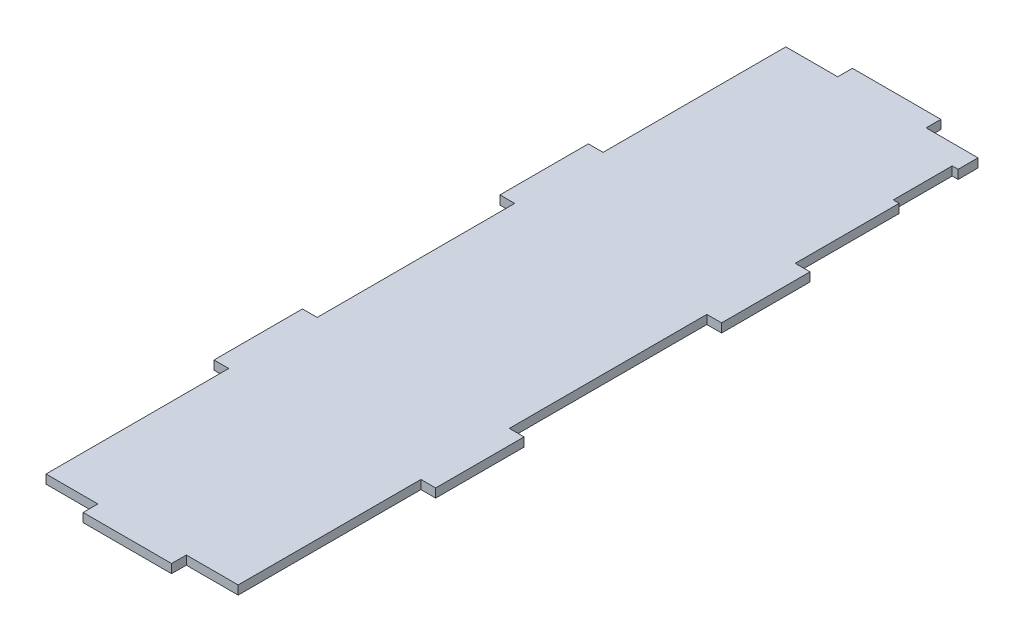
ISO-10303-21;
HEADER;
FILE_DESCRIPTION(('STEP AP214'),'2;1');
FILE_NAME('part.step','',(''),(''),'','','');
FILE_SCHEMA(('AUTOMOTIVE_DESIGN { 1 0 10303 214 1 1 1 1 }'));
ENDSEC;
DATA;
#1=APPLICATION_CONTEXT('core data for automotive mechanical design processes');
#2=APPLICATION_PROTOCOL_DEFINITION('international standard','automotive_design',2000,#1);
#3=PRODUCT_CONTEXT('',#1,'mechanical');
#4=PRODUCT('Part','Part','',(#3));
#5=PRODUCT_RELATED_PRODUCT_CATEGORY('part','',(#4));
#6=PRODUCT_DEFINITION_FORMATION('','',#4);
#7=PRODUCT_DEFINITION_CONTEXT('part definition',#1,'design');
#8=PRODUCT_DEFINITION('design','',#6,#7);
#9=PRODUCT_DEFINITION_SHAPE('','',#8);
#10=(LENGTH_UNIT() NAMED_UNIT(*) SI_UNIT(.MILLI.,.METRE.));
#11=(NAMED_UNIT(*) PLANE_ANGLE_UNIT() SI_UNIT($,.RADIAN.));
#12=(NAMED_UNIT(*) SI_UNIT($,.STERADIAN.) SOLID_ANGLE_UNIT());
#13=UNCERTAINTY_MEASURE_WITH_UNIT(LENGTH_MEASURE(1.E-05),#10,'distance_accuracy_value','');
#14=(GEOMETRIC_REPRESENTATION_CONTEXT(3) GLOBAL_UNCERTAINTY_ASSIGNED_CONTEXT((#13)) GLOBAL_UNIT_ASSIGNED_CONTEXT((#10,
#11,#12)) REPRESENTATION_CONTEXT('',''));
#15=CARTESIAN_POINT('',(0.,0.,0.));
#16=DIRECTION('',(0.,0.,1.));
#17=DIRECTION('',(1.,0.,0.));
#18=AXIS2_PLACEMENT_3D('',#15,#16,#17);
#19=CARTESIAN_POINT('',(32.6,0.,-63.5));
#20=DIRECTION('',(1.,0.,0.));
#21=DIRECTION('',(0.,0.,-1.));
#22=AXIS2_PLACEMENT_3D('',#19,#20,#21);
#23=PLANE('',#22);
#24=DIRECTION('',(0.,1.,0.));
#25=VECTOR('',#24,1.);
#26=CARTESIAN_POINT('',(32.6,0.,-118.75));
#27=LINE('',#26,#25);
#28=CARTESIAN_POINT('',(32.6,0.,-118.75));
#29=VERTEX_POINT('',#28);
#30=CARTESIAN_POINT('',(32.6,3.,-118.75));
#31=VERTEX_POINT('',#30);
#32=EDGE_CURVE('E293',#29,#31,#27,.T.);
#33=ORIENTED_EDGE('',*,*,#32,.F.);
#34=DIRECTION('',(0.,0.,-1.));
#35=VECTOR('',#34,1.);
#36=CARTESIAN_POINT('',(32.6,0.,-63.5));
#37=LINE('',#36,#35);
#38=CARTESIAN_POINT('',(32.6,0.,-125.5));
#39=VERTEX_POINT('',#38);
#40=EDGE_CURVE('E386',#29,#39,#37,.T.);
#41=ORIENTED_EDGE('',*,*,#40,.T.);
#42=DIRECTION('',(0.,1.,0.));
#43=VECTOR('',#42,1.);
#44=CARTESIAN_POINT('',(32.6,0.,-125.5));
#45=LINE('',#44,#43);
#46=CARTESIAN_POINT('',(32.6,3.,-125.5));
#47=VERTEX_POINT('',#46);
#48=EDGE_CURVE('E415',#39,#47,#45,.T.);
#49=ORIENTED_EDGE('',*,*,#48,.T.);
#50=DIRECTION('',(0.,0.,-1.));
#51=VECTOR('',#50,1.);
#52=CARTESIAN_POINT('',(32.6,3.,-63.5));
#53=LINE('',#52,#51);
#54=EDGE_CURVE('E401',#31,#47,#53,.T.);
#55=ORIENTED_EDGE('',*,*,#54,.F.);
#56=EDGE_LOOP('',(#33,#41,#49,#55));
#57=FACE_BOUND('',#56,.T.);
#58=ADVANCED_FACE('F43',(#57),#23,.T.);
#59=CARTESIAN_POINT('',(37.6,3.,130.5));
#60=DIRECTION('',(0.,0.,-1.));
#61=DIRECTION('',(-1.,0.,0.));
#62=AXIS2_PLACEMENT_3D('',#59,#60,#61);
#63=PLANE('',#62);
#64=DIRECTION('',(0.,1.,0.));
#65=VECTOR('',#64,1.);
#66=CARTESIAN_POINT('',(15.,0.,130.5));
#67=LINE('',#66,#65);
#68=CARTESIAN_POINT('',(15.,0.,130.5));
#69=VERTEX_POINT('',#68);
#70=CARTESIAN_POINT('',(15.,3.,130.5));
#71=VERTEX_POINT('',#70);
#72=EDGE_CURVE('E328',#69,#71,#67,.T.);
#73=ORIENTED_EDGE('',*,*,#72,.T.);
#74=DIRECTION('',(1.,0.,0.));
#75=VECTOR('',#74,1.);
#76=CARTESIAN_POINT('',(37.6,3.,130.5));
#77=LINE('',#76,#75);
#78=CARTESIAN_POINT('',(-15.,3.,130.5));
#79=VERTEX_POINT('',#78);
#80=EDGE_CURVE('E560',#79,#71,#77,.T.);
#81=ORIENTED_EDGE('',*,*,#80,.F.);
#82=DIRECTION('',(0.,1.,0.));
#83=VECTOR('',#82,1.);
#84=CARTESIAN_POINT('',(-15.,0.,130.5));
#85=LINE('',#84,#83);
#86=CARTESIAN_POINT('',(-15.,0.,130.5));
#87=VERTEX_POINT('',#86);
#88=EDGE_CURVE('E441',#87,#79,#85,.T.);
#89=ORIENTED_EDGE('',*,*,#88,.F.);
#90=DIRECTION('',(1.,0.,0.));
#91=VECTOR('',#90,1.);
#92=CARTESIAN_POINT('',(37.6,0.,130.5));
#93=LINE('',#92,#91);
#94=EDGE_CURVE('E572',#87,#69,#93,.T.);
#95=ORIENTED_EDGE('',*,*,#94,.T.);
#96=EDGE_LOOP('',(#73,#81,#89,#95));
#97=FACE_BOUND('',#96,.T.);
#98=ADVANCED_FACE('F632',(#97),#63,.F.);
#99=CARTESIAN_POINT('',(37.6,3.,130.5));
#100=DIRECTION('',(-1.,0.,0.));
#101=DIRECTION('',(0.,0.,1.));
#102=AXIS2_PLACEMENT_3D('',#99,#100,#101);
#103=PLANE('',#102);
#104=DIRECTION('',(0.,1.,0.));
#105=VECTOR('',#104,1.);
#106=CARTESIAN_POINT('',(37.6,0.,63.5));
#107=LINE('',#106,#105);
#108=CARTESIAN_POINT('',(37.6,0.,63.5));
#109=VERTEX_POINT('',#108);
#110=CARTESIAN_POINT('',(37.6,3.,63.5));
#111=VERTEX_POINT('',#110);
#112=EDGE_CURVE('E311',#109,#111,#107,.T.);
#113=ORIENTED_EDGE('',*,*,#112,.F.);
#114=DIRECTION('',(0.,0.,-1.));
#115=VECTOR('',#114,1.);
#116=CARTESIAN_POINT('',(37.6,0.,130.5));
#117=LINE('',#116,#115);
#118=CARTESIAN_POINT('',(37.6,0.,33.5));
#119=VERTEX_POINT('',#118);
#120=EDGE_CURVE('E578',#109,#119,#117,.T.);
#121=ORIENTED_EDGE('',*,*,#120,.T.);
#122=DIRECTION('',(0.,1.,0.));
#123=VECTOR('',#122,1.);
#124=CARTESIAN_POINT('',(37.6,0.,33.5));
#125=LINE('',#124,#123);
#126=CARTESIAN_POINT('',(37.6,3.,33.5));
#127=VERTEX_POINT('',#126);
#128=EDGE_CURVE('E317',#119,#127,#125,.T.);
#129=ORIENTED_EDGE('',*,*,#128,.T.);
#130=DIRECTION('',(0.,0.,-1.));
#131=VECTOR('',#130,1.);
#132=CARTESIAN_POINT('',(37.6,3.,130.5));
#133=LINE('',#132,#131);
#134=EDGE_CURVE('E53',#111,#127,#133,.T.);
#135=ORIENTED_EDGE('',*,*,#134,.F.);
#136=EDGE_LOOP('',(#113,#121,#129,#135));
#137=FACE_BOUND('',#136,.T.);
#138=ADVANCED_FACE('F640',(#137),#103,.F.);
#139=DIRECTION('',(0.,1.,0.));
#140=VECTOR('',#139,1.);
#141=CARTESIAN_POINT('',(37.6,0.,-33.5));
#142=LINE('',#141,#140);
#143=CARTESIAN_POINT('',(37.6,0.,-33.5));
#144=VERTEX_POINT('',#143);
#145=CARTESIAN_POINT('',(37.6,3.,-33.5));
#146=VERTEX_POINT('',#145);
#147=EDGE_CURVE('E354',#144,#146,#142,.T.);
#148=ORIENTED_EDGE('',*,*,#147,.F.);
#149=CARTESIAN_POINT('',(37.6,0.,-63.5));
#150=VERTEX_POINT('',#149);
#151=EDGE_CURVE('E575',#144,#150,#117,.T.);
#152=ORIENTED_EDGE('',*,*,#151,.T.);
#153=DIRECTION('',(0.,1.,0.));
#154=VECTOR('',#153,1.);
#155=CARTESIAN_POINT('',(37.6,0.,-63.5));
#156=LINE('',#155,#154);
#157=CARTESIAN_POINT('',(37.6,3.,-63.5));
#158=VERTEX_POINT('',#157);
#159=EDGE_CURVE('E360',#150,#158,#156,.T.);
#160=ORIENTED_EDGE('',*,*,#159,.T.);
#161=EDGE_CURVE('E564',#146,#158,#133,.T.);
#162=ORIENTED_EDGE('',*,*,#161,.F.);
#163=EDGE_LOOP('',(#148,#152,#160,#162));
#164=FACE_BOUND('',#163,.T.);
#165=ADVANCED_FACE('F657',(#164),#103,.F.);
#166=CARTESIAN_POINT('',(37.6,3.,-130.5));
#167=DIRECTION('',(0.,0.,1.));
#168=DIRECTION('',(1.,0.,0.));
#169=AXIS2_PLACEMENT_3D('',#166,#167,#168);
#170=PLANE('',#169);
#171=DIRECTION('',(0.,1.,0.));
#172=VECTOR('',#171,1.);
#173=CARTESIAN_POINT('',(15.,0.,-130.5));
#174=LINE('',#173,#172);
#175=CARTESIAN_POINT('',(15.,0.,-130.5));
#176=VERTEX_POINT('',#175);
#177=CARTESIAN_POINT('',(15.,3.,-130.5));
#178=VERTEX_POINT('',#177);
#179=EDGE_CURVE('E393',#176,#178,#174,.T.);
#180=ORIENTED_EDGE('',*,*,#179,.F.);
#181=DIRECTION('',(-1.,0.,0.));
#182=VECTOR('',#181,1.);
#183=CARTESIAN_POINT('',(37.6,0.,-130.5));
#184=LINE('',#183,#182);
#185=CARTESIAN_POINT('',(-15.,0.,-130.5));
#186=VERTEX_POINT('',#185);
#187=EDGE_CURVE('E47',#176,#186,#184,.T.);
#188=ORIENTED_EDGE('',*,*,#187,.T.);
#189=DIRECTION('',(0.,1.,0.));
#190=VECTOR('',#189,1.);
#191=CARTESIAN_POINT('',(-15.,0.,-130.5));
#192=LINE('',#191,#190);
#193=CARTESIAN_POINT('',(-15.,3.,-130.5));
#194=VERTEX_POINT('',#193);
#195=EDGE_CURVE('E332',#186,#194,#192,.T.);
#196=ORIENTED_EDGE('',*,*,#195,.T.);
#197=DIRECTION('',(-1.,0.,0.));
#198=VECTOR('',#197,1.);
#199=CARTESIAN_POINT('',(37.6,3.,-130.5));
#200=LINE('',#199,#198);
#201=EDGE_CURVE('E11',#178,#194,#200,.T.);
#202=ORIENTED_EDGE('',*,*,#201,.F.);
#203=EDGE_LOOP('',(#180,#188,#196,#202));
#204=FACE_BOUND('',#203,.T.);
#205=ADVANCED_FACE('F592',(#204),#170,.F.);
#206=CARTESIAN_POINT('',(0.,3.,0.));
#207=DIRECTION('',(0.,1.,0.));
#208=DIRECTION('',(0.,0.,1.));
#209=AXIS2_PLACEMENT_3D('',#206,#207,#208);
#210=PLANE('',#209);
#211=DIRECTION('',(-1.,0.,0.));
#212=VECTOR('',#211,1.);
#213=CARTESIAN_POINT('',(32.6,3.,-118.75));
#214=LINE('',#213,#212);
#215=CARTESIAN_POINT('',(30.6,3.,-118.75));
#216=VERTEX_POINT('',#215);
#217=EDGE_CURVE('E277',#31,#216,#214,.T.);
#218=ORIENTED_EDGE('',*,*,#217,.F.);
#219=ORIENTED_EDGE('',*,*,#54,.T.);
#220=DIRECTION('',(-1.,0.,0.));
#221=VECTOR('',#220,1.);
#222=CARTESIAN_POINT('',(32.6,3.,-125.5));
#223=LINE('',#222,#221);
#224=CARTESIAN_POINT('',(15.,3.,-125.5));
#225=VERTEX_POINT('',#224);
#226=EDGE_CURVE('E397',#47,#225,#223,.T.);
#227=ORIENTED_EDGE('',*,*,#226,.T.);
#228=DIRECTION('',(0.,0.,-1.));
#229=VECTOR('',#228,1.);
#230=CARTESIAN_POINT('',(15.,3.,-125.5));
#231=LINE('',#230,#229);
#232=EDGE_CURVE('E292',#225,#178,#231,.T.);
#233=ORIENTED_EDGE('',*,*,#232,.T.);
#234=ORIENTED_EDGE('',*,*,#201,.T.);
#235=DIRECTION('',(0.,0.,-1.));
#236=VECTOR('',#235,1.);
#237=CARTESIAN_POINT('',(-15.,3.,-125.5));
#238=LINE('',#237,#236);
#239=CARTESIAN_POINT('',(-15.,3.,-125.5));
#240=VERTEX_POINT('',#239);
#241=EDGE_CURVE('E525',#240,#194,#238,.T.);
#242=ORIENTED_EDGE('',*,*,#241,.F.);
#243=DIRECTION('',(1.,0.,0.));
#244=VECTOR('',#243,1.);
#245=CARTESIAN_POINT('',(-32.6,3.,-125.5));
#246=LINE('',#245,#244);
#247=CARTESIAN_POINT('',(-32.6,3.,-125.5));
#248=VERTEX_POINT('',#247);
#249=EDGE_CURVE('E529',#248,#240,#246,.T.);
#250=ORIENTED_EDGE('',*,*,#249,.F.);
#251=DIRECTION('',(0.,0.,-1.));
#252=VECTOR('',#251,1.);
#253=CARTESIAN_POINT('',(-32.6,3.,-63.5));
#254=LINE('',#253,#252);
#255=CARTESIAN_POINT('',(-32.6,3.,-63.5));
#256=VERTEX_POINT('',#255);
#257=EDGE_CURVE('E534',#256,#248,#254,.T.);
#258=ORIENTED_EDGE('',*,*,#257,.F.);
#259=DIRECTION('',(1.,0.,0.));
#260=VECTOR('',#259,1.);
#261=CARTESIAN_POINT('',(-37.6,3.,-63.5));
#262=LINE('',#261,#260);
#263=CARTESIAN_POINT('',(-37.6,3.,-63.5));
#264=VERTEX_POINT('',#263);
#265=EDGE_CURVE('E487',#264,#256,#262,.T.);
#266=ORIENTED_EDGE('',*,*,#265,.F.);
#267=DIRECTION('',(0.,0.,1.));
#268=VECTOR('',#267,1.);
#269=CARTESIAN_POINT('',(-37.6,3.,130.5));
#270=LINE('',#269,#268);
#271=CARTESIAN_POINT('',(-37.6,3.,-33.5));
#272=VERTEX_POINT('',#271);
#273=EDGE_CURVE('E559',#264,#272,#270,.T.);
#274=ORIENTED_EDGE('',*,*,#273,.T.);
#275=DIRECTION('',(-1.,0.,0.));
#276=VECTOR('',#275,1.);
#277=CARTESIAN_POINT('',(-37.6,3.,-33.5));
#278=LINE('',#277,#276);
#279=CARTESIAN_POINT('',(-32.6,3.,-33.5));
#280=VERTEX_POINT('',#279);
#281=EDGE_CURVE('E488',#280,#272,#278,.T.);
#282=ORIENTED_EDGE('',*,*,#281,.F.);
#283=DIRECTION('',(0.,0.,-1.));
#284=VECTOR('',#283,1.);
#285=CARTESIAN_POINT('',(-32.6,3.,33.5));
#286=LINE('',#285,#284);
#287=CARTESIAN_POINT('',(-32.6,3.,33.5));
#288=VERTEX_POINT('',#287);
#289=EDGE_CURVE('E491',#288,#280,#286,.T.);
#290=ORIENTED_EDGE('',*,*,#289,.F.);
#291=DIRECTION('',(1.,0.,0.));
#292=VECTOR('',#291,1.);
#293=CARTESIAN_POINT('',(-37.6,3.,33.5));
#294=LINE('',#293,#292);
#295=CARTESIAN_POINT('',(-37.6,3.,33.5));
#296=VERTEX_POINT('',#295);
#297=EDGE_CURVE('E447',#296,#288,#294,.T.);
#298=ORIENTED_EDGE('',*,*,#297,.F.);
#299=CARTESIAN_POINT('',(-37.6,3.,63.5));
#300=VERTEX_POINT('',#299);
#301=EDGE_CURVE('E555',#296,#300,#270,.T.);
#302=ORIENTED_EDGE('',*,*,#301,.T.);
#303=DIRECTION('',(-1.,0.,0.));
#304=VECTOR('',#303,1.);
#305=CARTESIAN_POINT('',(-37.6,3.,63.5));
#306=LINE('',#305,#304);
#307=CARTESIAN_POINT('',(-32.6,3.,63.5));
#308=VERTEX_POINT('',#307);
#309=EDGE_CURVE('E429',#308,#300,#306,.T.);
#310=ORIENTED_EDGE('',*,*,#309,.F.);
#311=DIRECTION('',(0.,0.,-1.));
#312=VECTOR('',#311,1.);
#313=CARTESIAN_POINT('',(-32.6,3.,63.5));
#314=LINE('',#313,#312);
#315=CARTESIAN_POINT('',(-32.6,3.,125.5));
#316=VERTEX_POINT('',#315);
#317=EDGE_CURVE('E451',#316,#308,#314,.T.);
#318=ORIENTED_EDGE('',*,*,#317,.F.);
#319=DIRECTION('',(-1.,0.,0.));
#320=VECTOR('',#319,1.);
#321=CARTESIAN_POINT('',(-32.6,3.,125.5));
#322=LINE('',#321,#320);
#323=CARTESIAN_POINT('',(-15.,3.,125.5));
#324=VERTEX_POINT('',#323);
#325=EDGE_CURVE('E446',#324,#316,#322,.T.);
#326=ORIENTED_EDGE('',*,*,#325,.F.);
#327=DIRECTION('',(0.,0.,-1.));
#328=VECTOR('',#327,1.);
#329=CARTESIAN_POINT('',(-15.,3.,125.5));
#330=LINE('',#329,#328);
#331=EDGE_CURVE('E442',#79,#324,#330,.T.);
#332=ORIENTED_EDGE('',*,*,#331,.F.);
#333=ORIENTED_EDGE('',*,*,#80,.T.);
#334=DIRECTION('',(0.,0.,-1.));
#335=VECTOR('',#334,1.);
#336=CARTESIAN_POINT('',(15.,3.,125.5));
#337=LINE('',#336,#335);
#338=CARTESIAN_POINT('',(15.,3.,125.5));
#339=VERTEX_POINT('',#338);
#340=EDGE_CURVE('E302',#71,#339,#337,.T.);
#341=ORIENTED_EDGE('',*,*,#340,.T.);
#342=DIRECTION('',(1.,0.,0.));
#343=VECTOR('',#342,1.);
#344=CARTESIAN_POINT('',(32.6,3.,125.5));
#345=LINE('',#344,#343);
#346=CARTESIAN_POINT('',(32.6,3.,125.5));
#347=VERTEX_POINT('',#346);
#348=EDGE_CURVE('E321',#339,#347,#345,.T.);
#349=ORIENTED_EDGE('',*,*,#348,.T.);
#350=DIRECTION('',(0.,0.,-1.));
#351=VECTOR('',#350,1.);
#352=CARTESIAN_POINT('',(32.6,3.,63.5));
#353=LINE('',#352,#351);
#354=CARTESIAN_POINT('',(32.6,3.,63.5));
#355=VERTEX_POINT('',#354);
#356=EDGE_CURVE('E316',#347,#355,#353,.T.);
#357=ORIENTED_EDGE('',*,*,#356,.T.);
#358=DIRECTION('',(1.,0.,0.));
#359=VECTOR('',#358,1.);
#360=CARTESIAN_POINT('',(37.6,3.,63.5));
#361=LINE('',#360,#359);
#362=EDGE_CURVE('E312',#355,#111,#361,.T.);
#363=ORIENTED_EDGE('',*,*,#362,.T.);
#364=ORIENTED_EDGE('',*,*,#134,.T.);
#365=DIRECTION('',(-1.,0.,0.));
#366=VECTOR('',#365,1.);
#367=CARTESIAN_POINT('',(37.6,3.,33.5));
#368=LINE('',#367,#366);
#369=CARTESIAN_POINT('',(32.6,3.,33.5));
#370=VERTEX_POINT('',#369);
#371=EDGE_CURVE('E347',#127,#370,#368,.T.);
#372=ORIENTED_EDGE('',*,*,#371,.T.);
#373=DIRECTION('',(0.,0.,-1.));
#374=VECTOR('',#373,1.);
#375=CARTESIAN_POINT('',(32.6,3.,33.5));
#376=LINE('',#375,#374);
#377=CARTESIAN_POINT('',(32.6,3.,-33.5));
#378=VERTEX_POINT('',#377);
#379=EDGE_CURVE('E359',#370,#378,#376,.T.);
#380=ORIENTED_EDGE('',*,*,#379,.T.);
#381=DIRECTION('',(1.,0.,0.));
#382=VECTOR('',#381,1.);
#383=CARTESIAN_POINT('',(37.6,3.,-33.5));
#384=LINE('',#383,#382);
#385=EDGE_CURVE('E355',#378,#146,#384,.T.);
#386=ORIENTED_EDGE('',*,*,#385,.T.);
#387=ORIENTED_EDGE('',*,*,#161,.T.);
#388=DIRECTION('',(-1.,0.,0.));
#389=VECTOR('',#388,1.);
#390=CARTESIAN_POINT('',(37.6,3.,-63.5));
#391=LINE('',#390,#389);
#392=CARTESIAN_POINT('',(32.6,3.,-63.5));
#393=VERTEX_POINT('',#392);
#394=EDGE_CURVE('E382',#158,#393,#391,.T.);
#395=ORIENTED_EDGE('',*,*,#394,.T.);
#396=CARTESIAN_POINT('',(32.6,3.,-98.75));
#397=VERTEX_POINT('',#396);
#398=EDGE_CURVE('E402',#393,#397,#53,.T.);
#399=ORIENTED_EDGE('',*,*,#398,.T.);
#400=DIRECTION('',(1.,0.,0.));
#401=VECTOR('',#400,1.);
#402=CARTESIAN_POINT('',(32.6,3.,-98.75));
#403=LINE('',#402,#401);
#404=CARTESIAN_POINT('',(30.6,3.,-98.75));
#405=VERTEX_POINT('',#404);
#406=EDGE_CURVE('E61',#405,#397,#403,.T.);
#407=ORIENTED_EDGE('',*,*,#406,.F.);
#408=DIRECTION('',(0.,0.,1.));
#409=VECTOR('',#408,1.);
#410=CARTESIAN_POINT('',(30.6,3.,-98.75));
#411=LINE('',#410,#409);
#412=EDGE_CURVE('E261',#216,#405,#411,.T.);
#413=ORIENTED_EDGE('',*,*,#412,.F.);
#414=EDGE_LOOP('',(#218,#219,#227,#233,#234,#242,#250,#258,#266,#274,#282,#290,#298,#302,#310,
#318,#326,#332,#333,#341,#349,#357,#363,#364,#372,#380,#386,#387,#395,#399,#407,#413));
#415=FACE_BOUND('',#414,.T.);
#416=ADVANCED_FACE('F606',(#415),#210,.T.);
#417=CARTESIAN_POINT('',(0.,0.,0.));
#418=DIRECTION('',(0.,1.,0.));
#419=DIRECTION('',(0.,0.,1.));
#420=AXIS2_PLACEMENT_3D('',#417,#418,#419);
#421=PLANE('',#420);
#422=ORIENTED_EDGE('',*,*,#40,.F.);
#423=DIRECTION('',(-1.,0.,0.));
#424=VECTOR('',#423,1.);
#425=CARTESIAN_POINT('',(32.6,0.,-118.75));
#426=LINE('',#425,#424);
#427=CARTESIAN_POINT('',(30.6,0.,-118.75));
#428=VERTEX_POINT('',#427);
#429=EDGE_CURVE('E264',#29,#428,#426,.T.);
#430=ORIENTED_EDGE('',*,*,#429,.T.);
#431=DIRECTION('',(0.,0.,1.));
#432=VECTOR('',#431,1.);
#433=CARTESIAN_POINT('',(30.6,0.,-98.75));
#434=LINE('',#433,#432);
#435=CARTESIAN_POINT('',(30.6,0.,-98.75));
#436=VERTEX_POINT('',#435);
#437=EDGE_CURVE('E258',#428,#436,#434,.T.);
#438=ORIENTED_EDGE('',*,*,#437,.T.);
#439=DIRECTION('',(1.,0.,0.));
#440=VECTOR('',#439,1.);
#441=CARTESIAN_POINT('',(32.6,0.,-98.75));
#442=LINE('',#441,#440);
#443=CARTESIAN_POINT('',(32.6,0.,-98.75));
#444=VERTEX_POINT('',#443);
#445=EDGE_CURVE('E267',#436,#444,#442,.T.);
#446=ORIENTED_EDGE('',*,*,#445,.T.);
#447=CARTESIAN_POINT('',(32.6,0.,-63.5));
#448=VERTEX_POINT('',#447);
#449=EDGE_CURVE('E387',#448,#444,#37,.T.);
#450=ORIENTED_EDGE('',*,*,#449,.F.);
#451=DIRECTION('',(-1.,0.,0.));
#452=VECTOR('',#451,1.);
#453=CARTESIAN_POINT('',(37.6,0.,-63.5));
#454=LINE('',#453,#452);
#455=EDGE_CURVE('E390',#150,#448,#454,.T.);
#456=ORIENTED_EDGE('',*,*,#455,.F.);
#457=ORIENTED_EDGE('',*,*,#151,.F.);
#458=DIRECTION('',(1.,0.,0.));
#459=VECTOR('',#458,1.);
#460=CARTESIAN_POINT('',(37.6,0.,-33.5));
#461=LINE('',#460,#459);
#462=CARTESIAN_POINT('',(32.6,0.,-33.5));
#463=VERTEX_POINT('',#462);
#464=EDGE_CURVE('E343',#463,#144,#461,.T.);
#465=ORIENTED_EDGE('',*,*,#464,.F.);
#466=DIRECTION('',(0.,0.,-1.));
#467=VECTOR('',#466,1.);
#468=CARTESIAN_POINT('',(32.6,0.,33.5));
#469=LINE('',#468,#467);
#470=CARTESIAN_POINT('',(32.6,0.,33.5));
#471=VERTEX_POINT('',#470);
#472=EDGE_CURVE('E346',#471,#463,#469,.T.);
#473=ORIENTED_EDGE('',*,*,#472,.F.);
#474=DIRECTION('',(-1.,0.,0.));
#475=VECTOR('',#474,1.);
#476=CARTESIAN_POINT('',(37.6,0.,33.5));
#477=LINE('',#476,#475);
#478=EDGE_CURVE('E351',#119,#471,#477,.T.);
#479=ORIENTED_EDGE('',*,*,#478,.F.);
#480=ORIENTED_EDGE('',*,*,#120,.F.);
#481=DIRECTION('',(1.,0.,0.));
#482=VECTOR('',#481,1.);
#483=CARTESIAN_POINT('',(37.6,0.,63.5));
#484=LINE('',#483,#482);
#485=CARTESIAN_POINT('',(32.6,0.,63.5));
#486=VERTEX_POINT('',#485);
#487=EDGE_CURVE('E298',#486,#109,#484,.T.);
#488=ORIENTED_EDGE('',*,*,#487,.F.);
#489=DIRECTION('',(0.,0.,-1.));
#490=VECTOR('',#489,1.);
#491=CARTESIAN_POINT('',(32.6,0.,63.5));
#492=LINE('',#491,#490);
#493=CARTESIAN_POINT('',(32.6,0.,125.5));
#494=VERTEX_POINT('',#493);
#495=EDGE_CURVE('E301',#494,#486,#492,.T.);
#496=ORIENTED_EDGE('',*,*,#495,.F.);
#497=DIRECTION('',(1.,0.,0.));
#498=VECTOR('',#497,1.);
#499=CARTESIAN_POINT('',(32.6,0.,125.5));
#500=LINE('',#499,#498);
#501=CARTESIAN_POINT('',(15.,0.,125.5));
#502=VERTEX_POINT('',#501);
#503=EDGE_CURVE('E305',#502,#494,#500,.T.);
#504=ORIENTED_EDGE('',*,*,#503,.F.);
#505=DIRECTION('',(0.,0.,-1.));
#506=VECTOR('',#505,1.);
#507=CARTESIAN_POINT('',(15.,0.,125.5));
#508=LINE('',#507,#506);
#509=EDGE_CURVE('E308',#69,#502,#508,.T.);
#510=ORIENTED_EDGE('',*,*,#509,.F.);
#511=ORIENTED_EDGE('',*,*,#94,.F.);
#512=DIRECTION('',(0.,0.,-1.));
#513=VECTOR('',#512,1.);
#514=CARTESIAN_POINT('',(-15.,0.,125.5));
#515=LINE('',#514,#513);
#516=CARTESIAN_POINT('',(-15.,0.,125.5));
#517=VERTEX_POINT('',#516);
#518=EDGE_CURVE('E424',#87,#517,#515,.T.);
#519=ORIENTED_EDGE('',*,*,#518,.T.);
#520=DIRECTION('',(-1.,0.,0.));
#521=VECTOR('',#520,1.);
#522=CARTESIAN_POINT('',(-32.6,0.,125.5));
#523=LINE('',#522,#521);
#524=CARTESIAN_POINT('',(-32.6,0.,125.5));
#525=VERTEX_POINT('',#524);
#526=EDGE_CURVE('E428',#517,#525,#523,.T.);
#527=ORIENTED_EDGE('',*,*,#526,.T.);
#528=DIRECTION('',(0.,0.,-1.));
#529=VECTOR('',#528,1.);
#530=CARTESIAN_POINT('',(-32.6,0.,63.5));
#531=LINE('',#530,#529);
#532=CARTESIAN_POINT('',(-32.6,0.,63.5));
#533=VERTEX_POINT('',#532);
#534=EDGE_CURVE('E433',#525,#533,#531,.T.);
#535=ORIENTED_EDGE('',*,*,#534,.T.);
#536=DIRECTION('',(-1.,0.,0.));
#537=VECTOR('',#536,1.);
#538=CARTESIAN_POINT('',(-37.6,0.,63.5));
#539=LINE('',#538,#537);
#540=CARTESIAN_POINT('',(-37.6,0.,63.5));
#541=VERTEX_POINT('',#540);
#542=EDGE_CURVE('E437',#533,#541,#539,.T.);
#543=ORIENTED_EDGE('',*,*,#542,.T.);
#544=DIRECTION('',(0.,0.,1.));
#545=VECTOR('',#544,1.);
#546=CARTESIAN_POINT('',(-37.6,0.,130.5));
#547=LINE('',#546,#545);
#548=CARTESIAN_POINT('',(-37.6,0.,33.5));
#549=VERTEX_POINT('',#548);
#550=EDGE_CURVE('E461',#549,#541,#547,.T.);
#551=ORIENTED_EDGE('',*,*,#550,.F.);
#552=DIRECTION('',(1.,0.,0.));
#553=VECTOR('',#552,1.);
#554=CARTESIAN_POINT('',(-37.6,0.,33.5));
#555=LINE('',#554,#553);
#556=CARTESIAN_POINT('',(-32.6,0.,33.5));
#557=VERTEX_POINT('',#556);
#558=EDGE_CURVE('E492',#549,#557,#555,.T.);
#559=ORIENTED_EDGE('',*,*,#558,.T.);
#560=DIRECTION('',(0.,0.,-1.));
#561=VECTOR('',#560,1.);
#562=CARTESIAN_POINT('',(-32.6,0.,33.5));
#563=LINE('',#562,#561);
#564=CARTESIAN_POINT('',(-32.6,0.,-33.5));
#565=VERTEX_POINT('',#564);
#566=EDGE_CURVE('E502',#557,#565,#563,.T.);
#567=ORIENTED_EDGE('',*,*,#566,.T.);
#568=DIRECTION('',(-1.,0.,0.));
#569=VECTOR('',#568,1.);
#570=CARTESIAN_POINT('',(-37.6,0.,-33.5));
#571=LINE('',#570,#569);
#572=CARTESIAN_POINT('',(-37.6,0.,-33.5));
#573=VERTEX_POINT('',#572);
#574=EDGE_CURVE('E476',#565,#573,#571,.T.);
#575=ORIENTED_EDGE('',*,*,#574,.T.);
#576=CARTESIAN_POINT('',(-37.6,0.,-63.5));
#577=VERTEX_POINT('',#576);
#578=EDGE_CURVE('E571',#577,#573,#547,.T.);
#579=ORIENTED_EDGE('',*,*,#578,.F.);
#580=DIRECTION('',(1.,0.,0.));
#581=VECTOR('',#580,1.);
#582=CARTESIAN_POINT('',(-37.6,0.,-63.5));
#583=LINE('',#582,#581);
#584=CARTESIAN_POINT('',(-32.6,0.,-63.5));
#585=VERTEX_POINT('',#584);
#586=EDGE_CURVE('E530',#577,#585,#583,.T.);
#587=ORIENTED_EDGE('',*,*,#586,.T.);
#588=DIRECTION('',(0.,0.,-1.));
#589=VECTOR('',#588,1.);
#590=CARTESIAN_POINT('',(-32.6,0.,-63.5));
#591=LINE('',#590,#589);
#592=CARTESIAN_POINT('',(-32.6,0.,-125.5));
#593=VERTEX_POINT('',#592);
#594=EDGE_CURVE('E548',#585,#593,#591,.T.);
#595=ORIENTED_EDGE('',*,*,#594,.T.);
#596=DIRECTION('',(1.,0.,0.));
#597=VECTOR('',#596,1.);
#598=CARTESIAN_POINT('',(-32.6,0.,-125.5));
#599=LINE('',#598,#597);
#600=CARTESIAN_POINT('',(-15.,0.,-125.5));
#601=VERTEX_POINT('',#600);
#602=EDGE_CURVE('E544',#593,#601,#599,.T.);
#603=ORIENTED_EDGE('',*,*,#602,.T.);
#604=DIRECTION('',(0.,0.,-1.));
#605=VECTOR('',#604,1.);
#606=CARTESIAN_POINT('',(-15.,0.,-125.5));
#607=LINE('',#606,#605);
#608=EDGE_CURVE('E512',#601,#186,#607,.T.);
#609=ORIENTED_EDGE('',*,*,#608,.T.);
#610=ORIENTED_EDGE('',*,*,#187,.F.);
#611=DIRECTION('',(0.,0.,-1.));
#612=VECTOR('',#611,1.);
#613=CARTESIAN_POINT('',(15.,0.,-125.5));
#614=LINE('',#613,#612);
#615=CARTESIAN_POINT('',(15.,0.,-125.5));
#616=VERTEX_POINT('',#615);
#617=EDGE_CURVE('E378',#616,#176,#614,.T.);
#618=ORIENTED_EDGE('',*,*,#617,.F.);
#619=DIRECTION('',(-1.,0.,0.));
#620=VECTOR('',#619,1.);
#621=CARTESIAN_POINT('',(32.6,0.,-125.5));
#622=LINE('',#621,#620);
#623=EDGE_CURVE('E381',#39,#616,#622,.T.);
#624=ORIENTED_EDGE('',*,*,#623,.F.);
#625=EDGE_LOOP('',(#422,#430,#438,#446,#450,#456,#457,#465,#473,#479,#480,#488,#496,#504,#510,
#511,#519,#527,#535,#543,#551,#559,#567,#575,#579,#587,#595,#603,#609,#610,#618,#624));
#626=FACE_BOUND('',#625,.T.);
#627=ADVANCED_FACE('F275',(#626),#421,.F.);
#628=CARTESIAN_POINT('',(-37.6,3.,130.5));
#629=DIRECTION('',(1.,0.,0.));
#630=DIRECTION('',(0.,0.,-1.));
#631=AXIS2_PLACEMENT_3D('',#628,#629,#630);
#632=PLANE('',#631);
#633=ORIENTED_EDGE('',*,*,#578,.T.);
#634=DIRECTION('',(0.,1.,0.));
#635=VECTOR('',#634,1.);
#636=CARTESIAN_POINT('',(-37.6,0.,-33.5));
#637=LINE('',#636,#635);
#638=EDGE_CURVE('E483',#573,#272,#637,.T.);
#639=ORIENTED_EDGE('',*,*,#638,.T.);
#640=ORIENTED_EDGE('',*,*,#273,.F.);
#641=DIRECTION('',(0.,1.,0.));
#642=VECTOR('',#641,1.);
#643=CARTESIAN_POINT('',(-37.6,0.,-63.5));
#644=LINE('',#643,#642);
#645=EDGE_CURVE('E509',#577,#264,#644,.T.);
#646=ORIENTED_EDGE('',*,*,#645,.F.);
#647=EDGE_LOOP('',(#633,#639,#640,#646));
#648=FACE_BOUND('',#647,.T.);
#649=ADVANCED_FACE('F685',(#648),#632,.F.);
#650=ORIENTED_EDGE('',*,*,#550,.T.);
#651=DIRECTION('',(0.,1.,0.));
#652=VECTOR('',#651,1.);
#653=CARTESIAN_POINT('',(-37.6,0.,63.5));
#654=LINE('',#653,#652);
#655=EDGE_CURVE('E457',#541,#300,#654,.T.);
#656=ORIENTED_EDGE('',*,*,#655,.T.);
#657=ORIENTED_EDGE('',*,*,#301,.F.);
#658=DIRECTION('',(0.,1.,0.));
#659=VECTOR('',#658,1.);
#660=CARTESIAN_POINT('',(-37.6,0.,33.5));
#661=LINE('',#660,#659);
#662=EDGE_CURVE('E473',#549,#296,#661,.T.);
#663=ORIENTED_EDGE('',*,*,#662,.F.);
#664=EDGE_LOOP('',(#650,#656,#657,#663));
#665=FACE_BOUND('',#664,.T.);
#666=ADVANCED_FACE('F45',(#665),#632,.F.);
#667=CARTESIAN_POINT('',(-15.,0.,-125.5));
#668=DIRECTION('',(1.,0.,0.));
#669=DIRECTION('',(0.,0.,-1.));
#670=AXIS2_PLACEMENT_3D('',#667,#668,#669);
#671=PLANE('',#670);
#672=ORIENTED_EDGE('',*,*,#241,.T.);
#673=ORIENTED_EDGE('',*,*,#195,.F.);
#674=ORIENTED_EDGE('',*,*,#608,.F.);
#675=DIRECTION('',(0.,1.,0.));
#676=VECTOR('',#675,1.);
#677=CARTESIAN_POINT('',(-15.,0.,-125.5));
#678=LINE('',#677,#676);
#679=EDGE_CURVE('E519',#601,#240,#678,.T.);
#680=ORIENTED_EDGE('',*,*,#679,.T.);
#681=EDGE_LOOP('',(#672,#673,#674,#680));
#682=FACE_BOUND('',#681,.T.);
#683=ADVANCED_FACE('F597',(#682),#671,.F.);
#684=CARTESIAN_POINT('',(-32.6,0.,-125.5));
#685=DIRECTION('',(0.,0.,1.));
#686=DIRECTION('',(1.,0.,0.));
#687=AXIS2_PLACEMENT_3D('',#684,#685,#686);
#688=PLANE('',#687);
#689=ORIENTED_EDGE('',*,*,#249,.T.);
#690=ORIENTED_EDGE('',*,*,#679,.F.);
#691=ORIENTED_EDGE('',*,*,#602,.F.);
#692=DIRECTION('',(0.,1.,0.));
#693=VECTOR('',#692,1.);
#694=CARTESIAN_POINT('',(-32.6,0.,-125.5));
#695=LINE('',#694,#693);
#696=EDGE_CURVE('E516',#593,#248,#695,.T.);
#697=ORIENTED_EDGE('',*,*,#696,.T.);
#698=EDGE_LOOP('',(#689,#690,#691,#697));
#699=FACE_BOUND('',#698,.T.);
#700=ADVANCED_FACE('F601',(#699),#688,.F.);
#701=CARTESIAN_POINT('',(-32.6,0.,-63.5));
#702=DIRECTION('',(1.,0.,0.));
#703=DIRECTION('',(0.,0.,-1.));
#704=AXIS2_PLACEMENT_3D('',#701,#702,#703);
#705=PLANE('',#704);
#706=ORIENTED_EDGE('',*,*,#257,.T.);
#707=ORIENTED_EDGE('',*,*,#696,.F.);
#708=ORIENTED_EDGE('',*,*,#594,.F.);
#709=DIRECTION('',(0.,1.,0.));
#710=VECTOR('',#709,1.);
#711=CARTESIAN_POINT('',(-32.6,0.,-63.5));
#712=LINE('',#711,#710);
#713=EDGE_CURVE('E513',#585,#256,#712,.T.);
#714=ORIENTED_EDGE('',*,*,#713,.T.);
#715=EDGE_LOOP('',(#706,#707,#708,#714));
#716=FACE_BOUND('',#715,.T.);
#717=ADVANCED_FACE('F888',(#716),#705,.F.);
#718=CARTESIAN_POINT('',(-37.6,0.,-63.5));
#719=DIRECTION('',(0.,0.,1.));
#720=DIRECTION('',(1.,0.,0.));
#721=AXIS2_PLACEMENT_3D('',#718,#719,#720);
#722=PLANE('',#721);
#723=ORIENTED_EDGE('',*,*,#265,.T.);
#724=ORIENTED_EDGE('',*,*,#713,.F.);
#725=ORIENTED_EDGE('',*,*,#586,.F.);
#726=ORIENTED_EDGE('',*,*,#645,.T.);
#727=EDGE_LOOP('',(#723,#724,#725,#726));
#728=FACE_BOUND('',#727,.T.);
#729=ADVANCED_FACE('F885',(#728),#722,.F.);
#730=CARTESIAN_POINT('',(-37.6,0.,-33.5));
#731=DIRECTION('',(0.,0.,-1.));
#732=DIRECTION('',(-1.,0.,0.));
#733=AXIS2_PLACEMENT_3D('',#730,#731,#732);
#734=PLANE('',#733);
#735=ORIENTED_EDGE('',*,*,#281,.T.);
#736=ORIENTED_EDGE('',*,*,#638,.F.);
#737=ORIENTED_EDGE('',*,*,#574,.F.);
#738=DIRECTION('',(0.,1.,0.));
#739=VECTOR('',#738,1.);
#740=CARTESIAN_POINT('',(-32.6,0.,-33.5));
#741=LINE('',#740,#739);
#742=EDGE_CURVE('E480',#565,#280,#741,.T.);
#743=ORIENTED_EDGE('',*,*,#742,.T.);
#744=EDGE_LOOP('',(#735,#736,#737,#743));
#745=FACE_BOUND('',#744,.T.);
#746=ADVANCED_FACE('F689',(#745),#734,.F.);
#747=CARTESIAN_POINT('',(-32.6,0.,33.5));
#748=DIRECTION('',(1.,0.,0.));
#749=DIRECTION('',(0.,0.,-1.));
#750=AXIS2_PLACEMENT_3D('',#747,#748,#749);
#751=PLANE('',#750);
#752=ORIENTED_EDGE('',*,*,#289,.T.);
#753=ORIENTED_EDGE('',*,*,#742,.F.);
#754=ORIENTED_EDGE('',*,*,#566,.F.);
#755=DIRECTION('',(0.,1.,0.));
#756=VECTOR('',#755,1.);
#757=CARTESIAN_POINT('',(-32.6,0.,33.5));
#758=LINE('',#757,#756);
#759=EDGE_CURVE('E477',#557,#288,#758,.T.);
#760=ORIENTED_EDGE('',*,*,#759,.T.);
#761=EDGE_LOOP('',(#752,#753,#754,#760));
#762=FACE_BOUND('',#761,.T.);
#763=ADVANCED_FACE('F693',(#762),#751,.F.);
#764=CARTESIAN_POINT('',(-37.6,0.,33.5));
#765=DIRECTION('',(0.,0.,1.));
#766=DIRECTION('',(1.,0.,0.));
#767=AXIS2_PLACEMENT_3D('',#764,#765,#766);
#768=PLANE('',#767);
#769=ORIENTED_EDGE('',*,*,#297,.T.);
#770=ORIENTED_EDGE('',*,*,#759,.F.);
#771=ORIENTED_EDGE('',*,*,#558,.F.);
#772=ORIENTED_EDGE('',*,*,#662,.T.);
#773=EDGE_LOOP('',(#769,#770,#771,#772));
#774=FACE_BOUND('',#773,.T.);
#775=ADVANCED_FACE('F695',(#774),#768,.F.);
#776=CARTESIAN_POINT('',(-37.6,0.,63.5));
#777=DIRECTION('',(0.,0.,-1.));
#778=DIRECTION('',(-1.,0.,0.));
#779=AXIS2_PLACEMENT_3D('',#776,#777,#778);
#780=PLANE('',#779);
#781=ORIENTED_EDGE('',*,*,#309,.T.);
#782=ORIENTED_EDGE('',*,*,#655,.F.);
#783=ORIENTED_EDGE('',*,*,#542,.F.);
#784=DIRECTION('',(0.,1.,0.));
#785=VECTOR('',#784,1.);
#786=CARTESIAN_POINT('',(-32.6,0.,63.5));
#787=LINE('',#786,#785);
#788=EDGE_CURVE('E462',#533,#308,#787,.T.);
#789=ORIENTED_EDGE('',*,*,#788,.T.);
#790=EDGE_LOOP('',(#781,#782,#783,#789));
#791=FACE_BOUND('',#790,.T.);
#792=ADVANCED_FACE('F703',(#791),#780,.F.);
#793=CARTESIAN_POINT('',(-32.6,0.,63.5));
#794=DIRECTION('',(1.,0.,0.));
#795=DIRECTION('',(0.,0.,-1.));
#796=AXIS2_PLACEMENT_3D('',#793,#794,#795);
#797=PLANE('',#796);
#798=ORIENTED_EDGE('',*,*,#317,.T.);
#799=ORIENTED_EDGE('',*,*,#788,.F.);
#800=ORIENTED_EDGE('',*,*,#534,.F.);
#801=DIRECTION('',(0.,1.,0.));
#802=VECTOR('',#801,1.);
#803=CARTESIAN_POINT('',(-32.6,0.,125.5));
#804=LINE('',#803,#802);
#805=EDGE_CURVE('E465',#525,#316,#804,.T.);
#806=ORIENTED_EDGE('',*,*,#805,.T.);
#807=EDGE_LOOP('',(#798,#799,#800,#806));
#808=FACE_BOUND('',#807,.T.);
#809=ADVANCED_FACE('F706',(#808),#797,.F.);
#810=CARTESIAN_POINT('',(-32.6,0.,125.5));
#811=DIRECTION('',(0.,0.,-1.));
#812=DIRECTION('',(-1.,0.,0.));
#813=AXIS2_PLACEMENT_3D('',#810,#811,#812);
#814=PLANE('',#813);
#815=ORIENTED_EDGE('',*,*,#325,.T.);
#816=ORIENTED_EDGE('',*,*,#805,.F.);
#817=ORIENTED_EDGE('',*,*,#526,.F.);
#818=DIRECTION('',(0.,1.,0.));
#819=VECTOR('',#818,1.);
#820=CARTESIAN_POINT('',(-15.,0.,125.5));
#821=LINE('',#820,#819);
#822=EDGE_CURVE('E468',#517,#324,#821,.T.);
#823=ORIENTED_EDGE('',*,*,#822,.T.);
#824=EDGE_LOOP('',(#815,#816,#817,#823));
#825=FACE_BOUND('',#824,.T.);
#826=ADVANCED_FACE('F712',(#825),#814,.F.);
#827=CARTESIAN_POINT('',(-15.,0.,125.5));
#828=DIRECTION('',(1.,0.,0.));
#829=DIRECTION('',(0.,0.,-1.));
#830=AXIS2_PLACEMENT_3D('',#827,#828,#829);
#831=PLANE('',#830);
#832=ORIENTED_EDGE('',*,*,#331,.T.);
#833=ORIENTED_EDGE('',*,*,#822,.F.);
#834=ORIENTED_EDGE('',*,*,#518,.F.);
#835=ORIENTED_EDGE('',*,*,#88,.T.);
#836=EDGE_LOOP('',(#832,#833,#834,#835));
#837=FACE_BOUND('',#836,.T.);
#838=ADVANCED_FACE('F651',(#837),#831,.F.);
#839=CARTESIAN_POINT('',(37.6,0.,-63.5));
#840=DIRECTION('',(0.,0.,-1.));
#841=DIRECTION('',(-1.,0.,0.));
#842=AXIS2_PLACEMENT_3D('',#839,#840,#841);
#843=PLANE('',#842);
#844=ORIENTED_EDGE('',*,*,#394,.F.);
#845=ORIENTED_EDGE('',*,*,#159,.F.);
#846=ORIENTED_EDGE('',*,*,#455,.T.);
#847=DIRECTION('',(0.,1.,0.));
#848=VECTOR('',#847,1.);
#849=CARTESIAN_POINT('',(32.6,0.,-63.5));
#850=LINE('',#849,#848);
#851=EDGE_CURVE('E412',#448,#393,#850,.T.);
#852=ORIENTED_EDGE('',*,*,#851,.T.);
#853=EDGE_LOOP('',(#844,#845,#846,#852));
#854=FACE_BOUND('',#853,.T.);
#855=ADVANCED_FACE('F645',(#854),#843,.T.);
#856=DIRECTION('',(0.,1.,0.));
#857=VECTOR('',#856,1.);
#858=CARTESIAN_POINT('',(32.6,0.,-98.75));
#859=LINE('',#858,#857);
#860=EDGE_CURVE('E263',#444,#397,#859,.T.);
#861=ORIENTED_EDGE('',*,*,#860,.T.);
#862=ORIENTED_EDGE('',*,*,#398,.F.);
#863=ORIENTED_EDGE('',*,*,#851,.F.);
#864=ORIENTED_EDGE('',*,*,#449,.T.);
#865=EDGE_LOOP('',(#861,#862,#863,#864));
#866=FACE_BOUND('',#865,.T.);
#867=ADVANCED_FACE('F634',(#866),#23,.T.);
#868=CARTESIAN_POINT('',(32.6,0.,-125.5));
#869=DIRECTION('',(0.,0.,-1.));
#870=DIRECTION('',(-1.,0.,0.));
#871=AXIS2_PLACEMENT_3D('',#868,#869,#870);
#872=PLANE('',#871);
#873=ORIENTED_EDGE('',*,*,#226,.F.);
#874=ORIENTED_EDGE('',*,*,#48,.F.);
#875=ORIENTED_EDGE('',*,*,#623,.T.);
#876=DIRECTION('',(0.,1.,0.));
#877=VECTOR('',#876,1.);
#878=CARTESIAN_POINT('',(15.,0.,-125.5));
#879=LINE('',#878,#877);
#880=EDGE_CURVE('E419',#616,#225,#879,.T.);
#881=ORIENTED_EDGE('',*,*,#880,.T.);
#882=EDGE_LOOP('',(#873,#874,#875,#881));
#883=FACE_BOUND('',#882,.T.);
#884=ADVANCED_FACE('F614',(#883),#872,.T.);
#885=CARTESIAN_POINT('',(15.,0.,-125.5));
#886=DIRECTION('',(1.,0.,0.));
#887=DIRECTION('',(0.,0.,-1.));
#888=AXIS2_PLACEMENT_3D('',#885,#886,#887);
#889=PLANE('',#888);
#890=ORIENTED_EDGE('',*,*,#232,.F.);
#891=ORIENTED_EDGE('',*,*,#880,.F.);
#892=ORIENTED_EDGE('',*,*,#617,.T.);
#893=ORIENTED_EDGE('',*,*,#179,.T.);
#894=EDGE_LOOP('',(#890,#891,#892,#893));
#895=FACE_BOUND('',#894,.T.);
#896=ADVANCED_FACE('F610',(#895),#889,.T.);
#897=CARTESIAN_POINT('',(37.6,0.,33.5));
#898=DIRECTION('',(0.,0.,-1.));
#899=DIRECTION('',(-1.,0.,0.));
#900=AXIS2_PLACEMENT_3D('',#897,#898,#899);
#901=PLANE('',#900);
#902=ORIENTED_EDGE('',*,*,#371,.F.);
#903=ORIENTED_EDGE('',*,*,#128,.F.);
#904=ORIENTED_EDGE('',*,*,#478,.T.);
#905=DIRECTION('',(0.,1.,0.));
#906=VECTOR('',#905,1.);
#907=CARTESIAN_POINT('',(32.6,0.,33.5));
#908=LINE('',#907,#906);
#909=EDGE_CURVE('E370',#471,#370,#908,.T.);
#910=ORIENTED_EDGE('',*,*,#909,.T.);
#911=EDGE_LOOP('',(#902,#903,#904,#910));
#912=FACE_BOUND('',#911,.T.);
#913=ADVANCED_FACE('F669',(#912),#901,.T.);
#914=CARTESIAN_POINT('',(32.6,0.,33.5));
#915=DIRECTION('',(1.,0.,0.));
#916=DIRECTION('',(0.,0.,-1.));
#917=AXIS2_PLACEMENT_3D('',#914,#915,#916);
#918=PLANE('',#917);
#919=ORIENTED_EDGE('',*,*,#379,.F.);
#920=ORIENTED_EDGE('',*,*,#909,.F.);
#921=ORIENTED_EDGE('',*,*,#472,.T.);
#922=DIRECTION('',(0.,1.,0.));
#923=VECTOR('',#922,1.);
#924=CARTESIAN_POINT('',(32.6,0.,-33.5));
#925=LINE('',#924,#923);
#926=EDGE_CURVE('E373',#463,#378,#925,.T.);
#927=ORIENTED_EDGE('',*,*,#926,.T.);
#928=EDGE_LOOP('',(#919,#920,#921,#927));
#929=FACE_BOUND('',#928,.T.);
#930=ADVANCED_FACE('F667',(#929),#918,.T.);
#931=CARTESIAN_POINT('',(37.6,0.,-33.5));
#932=DIRECTION('',(0.,0.,1.));
#933=DIRECTION('',(1.,0.,0.));
#934=AXIS2_PLACEMENT_3D('',#931,#932,#933);
#935=PLANE('',#934);
#936=ORIENTED_EDGE('',*,*,#385,.F.);
#937=ORIENTED_EDGE('',*,*,#926,.F.);
#938=ORIENTED_EDGE('',*,*,#464,.T.);
#939=ORIENTED_EDGE('',*,*,#147,.T.);
#940=EDGE_LOOP('',(#936,#937,#938,#939));
#941=FACE_BOUND('',#940,.T.);
#942=ADVANCED_FACE('F663',(#941),#935,.T.);
#943=CARTESIAN_POINT('',(15.,0.,125.5));
#944=DIRECTION('',(1.,0.,0.));
#945=DIRECTION('',(0.,0.,-1.));
#946=AXIS2_PLACEMENT_3D('',#943,#944,#945);
#947=PLANE('',#946);
#948=ORIENTED_EDGE('',*,*,#340,.F.);
#949=ORIENTED_EDGE('',*,*,#72,.F.);
#950=ORIENTED_EDGE('',*,*,#509,.T.);
#951=DIRECTION('',(0.,1.,0.));
#952=VECTOR('',#951,1.);
#953=CARTESIAN_POINT('',(15.,0.,125.5));
#954=LINE('',#953,#952);
#955=EDGE_CURVE('E333',#502,#339,#954,.T.);
#956=ORIENTED_EDGE('',*,*,#955,.T.);
#957=EDGE_LOOP('',(#948,#949,#950,#956));
#958=FACE_BOUND('',#957,.T.);
#959=ADVANCED_FACE('F720',(#958),#947,.T.);
#960=CARTESIAN_POINT('',(32.6,0.,125.5));
#961=DIRECTION('',(0.,0.,1.));
#962=DIRECTION('',(1.,0.,0.));
#963=AXIS2_PLACEMENT_3D('',#960,#961,#962);
#964=PLANE('',#963);
#965=ORIENTED_EDGE('',*,*,#348,.F.);
#966=ORIENTED_EDGE('',*,*,#955,.F.);
#967=ORIENTED_EDGE('',*,*,#503,.T.);
#968=DIRECTION('',(0.,1.,0.));
#969=VECTOR('',#968,1.);
#970=CARTESIAN_POINT('',(32.6,0.,125.5));
#971=LINE('',#970,#969);
#972=EDGE_CURVE('E336',#494,#347,#971,.T.);
#973=ORIENTED_EDGE('',*,*,#972,.T.);
#974=EDGE_LOOP('',(#965,#966,#967,#973));
#975=FACE_BOUND('',#974,.T.);
#976=ADVANCED_FACE('F723',(#975),#964,.T.);
#977=CARTESIAN_POINT('',(32.6,0.,63.5));
#978=DIRECTION('',(1.,0.,0.));
#979=DIRECTION('',(0.,0.,-1.));
#980=AXIS2_PLACEMENT_3D('',#977,#978,#979);
#981=PLANE('',#980);
#982=ORIENTED_EDGE('',*,*,#356,.F.);
#983=ORIENTED_EDGE('',*,*,#972,.F.);
#984=ORIENTED_EDGE('',*,*,#495,.T.);
#985=DIRECTION('',(0.,1.,0.));
#986=VECTOR('',#985,1.);
#987=CARTESIAN_POINT('',(32.6,0.,63.5));
#988=LINE('',#987,#986);
#989=EDGE_CURVE('E69',#486,#355,#988,.T.);
#990=ORIENTED_EDGE('',*,*,#989,.T.);
#991=EDGE_LOOP('',(#982,#983,#984,#990));
#992=FACE_BOUND('',#991,.T.);
#993=ADVANCED_FACE('F727',(#992),#981,.T.);
#994=CARTESIAN_POINT('',(37.6,0.,63.5));
#995=DIRECTION('',(0.,0.,1.));
#996=DIRECTION('',(1.,0.,0.));
#997=AXIS2_PLACEMENT_3D('',#994,#995,#996);
#998=PLANE('',#997);
#999=ORIENTED_EDGE('',*,*,#362,.F.);
#1000=ORIENTED_EDGE('',*,*,#989,.F.);
#1001=ORIENTED_EDGE('',*,*,#487,.T.);
#1002=ORIENTED_EDGE('',*,*,#112,.T.);
#1003=EDGE_LOOP('',(#999,#1000,#1001,#1002));
#1004=FACE_BOUND('',#1003,.T.);
#1005=ADVANCED_FACE('F629',(#1004),#998,.T.);
#1006=CARTESIAN_POINT('',(30.6,0.,-98.75));
#1007=DIRECTION('',(-1.,0.,0.));
#1008=DIRECTION('',(0.,0.,1.));
#1009=AXIS2_PLACEMENT_3D('',#1006,#1007,#1008);
#1010=PLANE('',#1009);
#1011=ORIENTED_EDGE('',*,*,#412,.T.);
#1012=DIRECTION('',(0.,1.,0.));
#1013=VECTOR('',#1012,1.);
#1014=CARTESIAN_POINT('',(30.6,0.,-98.75));
#1015=LINE('',#1014,#1013);
#1016=EDGE_CURVE('E254',#436,#405,#1015,.T.);
#1017=ORIENTED_EDGE('',*,*,#1016,.F.);
#1018=ORIENTED_EDGE('',*,*,#437,.F.);
#1019=DIRECTION('',(0.,1.,0.));
#1020=VECTOR('',#1019,1.);
#1021=CARTESIAN_POINT('',(30.6,0.,-118.75));
#1022=LINE('',#1021,#1020);
#1023=EDGE_CURVE('E289',#428,#216,#1022,.T.);
#1024=ORIENTED_EDGE('',*,*,#1023,.T.);
#1025=EDGE_LOOP('',(#1011,#1017,#1018,#1024));
#1026=FACE_BOUND('',#1025,.T.);
#1027=ADVANCED_FACE('F256',(#1026),#1010,.F.);
#1028=CARTESIAN_POINT('',(32.6,0.,-118.75));
#1029=DIRECTION('',(0.,0.,-1.));
#1030=DIRECTION('',(-1.,0.,0.));
#1031=AXIS2_PLACEMENT_3D('',#1028,#1029,#1030);
#1032=PLANE('',#1031);
#1033=ORIENTED_EDGE('',*,*,#217,.T.);
#1034=ORIENTED_EDGE('',*,*,#1023,.F.);
#1035=ORIENTED_EDGE('',*,*,#429,.F.);
#1036=ORIENTED_EDGE('',*,*,#32,.T.);
#1037=EDGE_LOOP('',(#1033,#1034,#1035,#1036));
#1038=FACE_BOUND('',#1037,.T.);
#1039=ADVANCED_FACE('F621',(#1038),#1032,.F.);
#1040=CARTESIAN_POINT('',(32.6,0.,-98.75));
#1041=DIRECTION('',(0.,0.,1.));
#1042=DIRECTION('',(1.,0.,0.));
#1043=AXIS2_PLACEMENT_3D('',#1040,#1041,#1042);
#1044=PLANE('',#1043);
#1045=ORIENTED_EDGE('',*,*,#406,.T.);
#1046=ORIENTED_EDGE('',*,*,#860,.F.);
#1047=ORIENTED_EDGE('',*,*,#445,.F.);
#1048=ORIENTED_EDGE('',*,*,#1016,.T.);
#1049=EDGE_LOOP('',(#1045,#1046,#1047,#1048));
#1050=FACE_BOUND('',#1049,.T.);
#1051=ADVANCED_FACE('F268',(#1050),#1044,.F.);
#1052=CLOSED_SHELL('',(#58,#98,#138,#165,#205,#416,#627,#649,#666,#683,#700,#717,#729,#746,#763,
#775,#792,#809,#826,#838,#855,#867,#884,#896,#913,#930,#942,#959,#976,#993,#1005,#1027,#1039,#1051));
#1053=MANIFOLD_SOLID_BREP('B2',#1052);
#1054=ADVANCED_BREP_SHAPE_REPRESENTATION('',(#18,#1053),#14);
#1055=SHAPE_DEFINITION_REPRESENTATION(#9,#1054);
ENDSEC;
END-ISO-10303-21;
